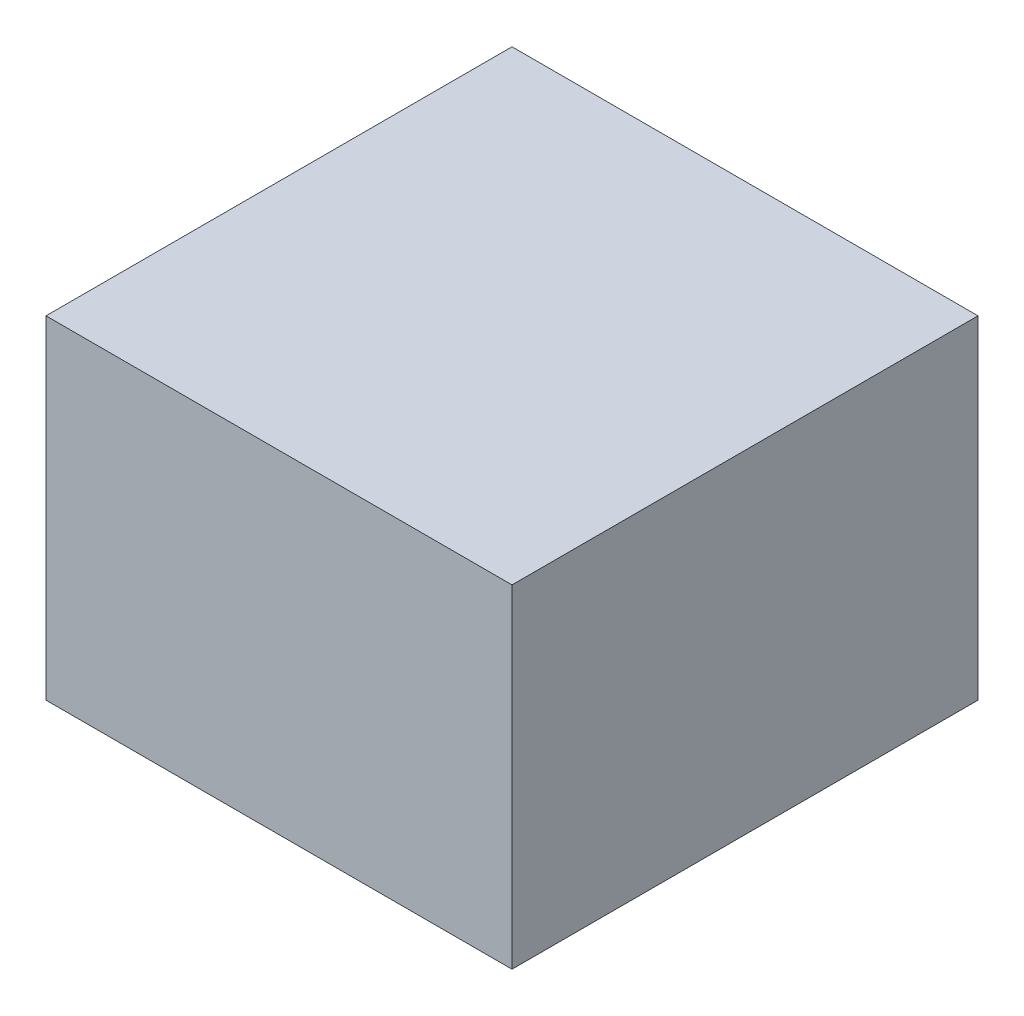
ISO-10303-21;
HEADER;
FILE_DESCRIPTION(('STEP AP214'),'2;1');
FILE_NAME('part.step','',(''),(''),'','','');
FILE_SCHEMA(('AUTOMOTIVE_DESIGN { 1 0 10303 214 1 1 1 1 }'));
ENDSEC;
DATA;
#1=APPLICATION_CONTEXT('core data for automotive mechanical design processes');
#2=APPLICATION_PROTOCOL_DEFINITION('international standard','automotive_design',2000,#1);
#3=PRODUCT_CONTEXT('',#1,'mechanical');
#4=PRODUCT('Part','Part','',(#3));
#5=PRODUCT_RELATED_PRODUCT_CATEGORY('part','',(#4));
#6=PRODUCT_DEFINITION_FORMATION('','',#4);
#7=PRODUCT_DEFINITION_CONTEXT('part definition',#1,'design');
#8=PRODUCT_DEFINITION('design','',#6,#7);
#9=PRODUCT_DEFINITION_SHAPE('','',#8);
#10=(LENGTH_UNIT() NAMED_UNIT(*) SI_UNIT(.MILLI.,.METRE.));
#11=(NAMED_UNIT(*) PLANE_ANGLE_UNIT() SI_UNIT($,.RADIAN.));
#12=(NAMED_UNIT(*) SI_UNIT($,.STERADIAN.) SOLID_ANGLE_UNIT());
#13=UNCERTAINTY_MEASURE_WITH_UNIT(LENGTH_MEASURE(1.E-05),#10,'distance_accuracy_value','');
#14=(GEOMETRIC_REPRESENTATION_CONTEXT(3) GLOBAL_UNCERTAINTY_ASSIGNED_CONTEXT((#13)) GLOBAL_UNIT_ASSIGNED_CONTEXT((#10,
#11,#12)) REPRESENTATION_CONTEXT('',''));
#15=CARTESIAN_POINT('',(0.,0.,0.));
#16=DIRECTION('',(0.,0.,1.));
#17=DIRECTION('',(1.,0.,0.));
#18=AXIS2_PLACEMENT_3D('',#15,#16,#17);
#19=CARTESIAN_POINT('',(350.,250.,-350.));
#20=DIRECTION('',(-1.,0.,0.));
#21=DIRECTION('',(0.,0.,1.));
#22=AXIS2_PLACEMENT_3D('',#19,#20,#21);
#23=PLANE('',#22);
#24=DIRECTION('',(0.,0.,-1.));
#25=VECTOR('',#24,1.);
#26=CARTESIAN_POINT('',(350.,-250.,-350.));
#27=LINE('',#26,#25);
#28=CARTESIAN_POINT('',(350.,-250.,350.));
#29=VERTEX_POINT('',#28);
#30=CARTESIAN_POINT('',(350.,-250.,-350.));
#31=VERTEX_POINT('',#30);
#32=EDGE_CURVE('E111',#29,#31,#27,.T.);
#33=ORIENTED_EDGE('',*,*,#32,.T.);
#34=DIRECTION('',(0.,-1.,0.));
#35=VECTOR('',#34,1.);
#36=CARTESIAN_POINT('',(350.,250.,-350.));
#37=LINE('',#36,#35);
#38=CARTESIAN_POINT('',(350.,250.,-350.));
#39=VERTEX_POINT('',#38);
#40=EDGE_CURVE('E11',#39,#31,#37,.T.);
#41=ORIENTED_EDGE('',*,*,#40,.F.);
#42=DIRECTION('',(0.,0.,-1.));
#43=VECTOR('',#42,1.);
#44=CARTESIAN_POINT('',(350.,250.,-350.));
#45=LINE('',#44,#43);
#46=CARTESIAN_POINT('',(350.,250.,350.));
#47=VERTEX_POINT('',#46);
#48=EDGE_CURVE('E95',#47,#39,#45,.T.);
#49=ORIENTED_EDGE('',*,*,#48,.F.);
#50=DIRECTION('',(0.,-1.,0.));
#51=VECTOR('',#50,1.);
#52=CARTESIAN_POINT('',(350.,250.,350.));
#53=LINE('',#52,#51);
#54=EDGE_CURVE('E107',#47,#29,#53,.T.);
#55=ORIENTED_EDGE('',*,*,#54,.T.);
#56=EDGE_LOOP('',(#33,#41,#49,#55));
#57=FACE_BOUND('',#56,.T.);
#58=ADVANCED_FACE('F43',(#57),#23,.F.);
#59=CARTESIAN_POINT('',(-350.,250.,-350.));
#60=DIRECTION('',(0.,0.,1.));
#61=DIRECTION('',(1.,0.,0.));
#62=AXIS2_PLACEMENT_3D('',#59,#60,#61);
#63=PLANE('',#62);
#64=DIRECTION('',(-1.,0.,0.));
#65=VECTOR('',#64,1.);
#66=CARTESIAN_POINT('',(-350.,-250.,-350.));
#67=LINE('',#66,#65);
#68=CARTESIAN_POINT('',(-350.,-250.,-350.));
#69=VERTEX_POINT('',#68);
#70=EDGE_CURVE('E100',#31,#69,#67,.T.);
#71=ORIENTED_EDGE('',*,*,#70,.T.);
#72=DIRECTION('',(0.,-1.,0.));
#73=VECTOR('',#72,1.);
#74=CARTESIAN_POINT('',(-350.,250.,-350.));
#75=LINE('',#74,#73);
#76=CARTESIAN_POINT('',(-350.,250.,-350.));
#77=VERTEX_POINT('',#76);
#78=EDGE_CURVE('E52',#77,#69,#75,.T.);
#79=ORIENTED_EDGE('',*,*,#78,.F.);
#80=DIRECTION('',(-1.,0.,0.));
#81=VECTOR('',#80,1.);
#82=CARTESIAN_POINT('',(-350.,250.,-350.));
#83=LINE('',#82,#81);
#84=EDGE_CURVE('E90',#39,#77,#83,.T.);
#85=ORIENTED_EDGE('',*,*,#84,.F.);
#86=ORIENTED_EDGE('',*,*,#40,.T.);
#87=EDGE_LOOP('',(#71,#79,#85,#86));
#88=FACE_BOUND('',#87,.T.);
#89=ADVANCED_FACE('F99',(#88),#63,.F.);
#90=CARTESIAN_POINT('',(-350.,250.,-350.));
#91=DIRECTION('',(1.,0.,0.));
#92=DIRECTION('',(0.,0.,-1.));
#93=AXIS2_PLACEMENT_3D('',#90,#91,#92);
#94=PLANE('',#93);
#95=DIRECTION('',(0.,0.,1.));
#96=VECTOR('',#95,1.);
#97=CARTESIAN_POINT('',(-350.,-250.,-350.));
#98=LINE('',#97,#96);
#99=CARTESIAN_POINT('',(-350.,-250.,350.));
#100=VERTEX_POINT('',#99);
#101=EDGE_CURVE('E77',#69,#100,#98,.T.);
#102=ORIENTED_EDGE('',*,*,#101,.T.);
#103=DIRECTION('',(0.,-1.,0.));
#104=VECTOR('',#103,1.);
#105=CARTESIAN_POINT('',(-350.,250.,350.));
#106=LINE('',#105,#104);
#107=CARTESIAN_POINT('',(-350.,250.,350.));
#108=VERTEX_POINT('',#107);
#109=EDGE_CURVE('E102',#108,#100,#106,.T.);
#110=ORIENTED_EDGE('',*,*,#109,.F.);
#111=DIRECTION('',(0.,0.,1.));
#112=VECTOR('',#111,1.);
#113=CARTESIAN_POINT('',(-350.,250.,-350.));
#114=LINE('',#113,#112);
#115=EDGE_CURVE('E93',#77,#108,#114,.T.);
#116=ORIENTED_EDGE('',*,*,#115,.F.);
#117=ORIENTED_EDGE('',*,*,#78,.T.);
#118=EDGE_LOOP('',(#102,#110,#116,#117));
#119=FACE_BOUND('',#118,.T.);
#120=ADVANCED_FACE('F103',(#119),#94,.F.);
#121=CARTESIAN_POINT('',(-350.,250.,350.));
#122=DIRECTION('',(0.,0.,-1.));
#123=DIRECTION('',(-1.,0.,0.));
#124=AXIS2_PLACEMENT_3D('',#121,#122,#123);
#125=PLANE('',#124);
#126=DIRECTION('',(1.,0.,0.));
#127=VECTOR('',#126,1.);
#128=CARTESIAN_POINT('',(-350.,-250.,350.));
#129=LINE('',#128,#127);
#130=EDGE_CURVE('E83',#100,#29,#129,.T.);
#131=ORIENTED_EDGE('',*,*,#130,.T.);
#132=ORIENTED_EDGE('',*,*,#54,.F.);
#133=DIRECTION('',(1.,0.,0.));
#134=VECTOR('',#133,1.);
#135=CARTESIAN_POINT('',(-350.,250.,350.));
#136=LINE('',#135,#134);
#137=EDGE_CURVE('E60',#108,#47,#136,.T.);
#138=ORIENTED_EDGE('',*,*,#137,.F.);
#139=ORIENTED_EDGE('',*,*,#109,.T.);
#140=EDGE_LOOP('',(#131,#132,#138,#139));
#141=FACE_BOUND('',#140,.T.);
#142=ADVANCED_FACE('F124',(#141),#125,.F.);
#143=CARTESIAN_POINT('',(0.,250.,0.));
#144=DIRECTION('',(0.,1.,0.));
#145=DIRECTION('',(0.,0.,1.));
#146=AXIS2_PLACEMENT_3D('',#143,#144,#145);
#147=PLANE('',#146);
#148=ORIENTED_EDGE('',*,*,#48,.T.);
#149=ORIENTED_EDGE('',*,*,#84,.T.);
#150=ORIENTED_EDGE('',*,*,#115,.T.);
#151=ORIENTED_EDGE('',*,*,#137,.T.);
#152=EDGE_LOOP('',(#148,#149,#150,#151));
#153=FACE_BOUND('',#152,.T.);
#154=ADVANCED_FACE('F91',(#153),#147,.T.);
#155=CARTESIAN_POINT('',(0.,-250.,0.));
#156=DIRECTION('',(0.,1.,0.));
#157=DIRECTION('',(0.,0.,1.));
#158=AXIS2_PLACEMENT_3D('',#155,#156,#157);
#159=PLANE('',#158);
#160=ORIENTED_EDGE('',*,*,#32,.F.);
#161=ORIENTED_EDGE('',*,*,#130,.F.);
#162=ORIENTED_EDGE('',*,*,#101,.F.);
#163=ORIENTED_EDGE('',*,*,#70,.F.);
#164=EDGE_LOOP('',(#160,#161,#162,#163));
#165=FACE_BOUND('',#164,.T.);
#166=ADVANCED_FACE('F127',(#165),#159,.F.);
#167=CLOSED_SHELL('',(#58,#89,#120,#142,#154,#166));
#168=MANIFOLD_SOLID_BREP('B2',#167);
#169=ADVANCED_BREP_SHAPE_REPRESENTATION('',(#18,#168),#14);
#170=SHAPE_DEFINITION_REPRESENTATION(#9,#169);
ENDSEC;
END-ISO-10303-21;
